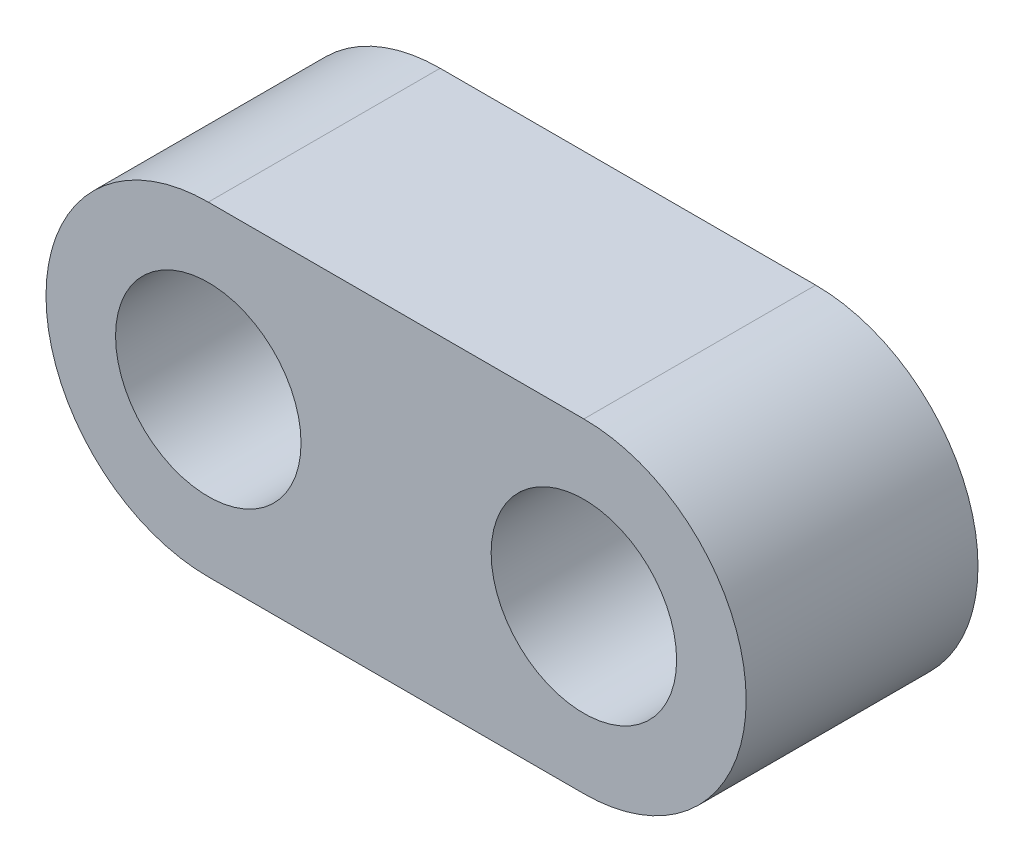
ISO-10303-21;
HEADER;
FILE_DESCRIPTION(('STEP AP214'),'2;1');
FILE_NAME('part.step','',(''),(''),'','','');
FILE_SCHEMA(('AUTOMOTIVE_DESIGN { 1 0 10303 214 1 1 1 1 }'));
ENDSEC;
DATA;
#1=APPLICATION_CONTEXT('core data for automotive mechanical design processes');
#2=APPLICATION_PROTOCOL_DEFINITION('international standard','automotive_design',2000,#1);
#3=PRODUCT_CONTEXT('',#1,'mechanical');
#4=PRODUCT('Part','Part','',(#3));
#5=PRODUCT_RELATED_PRODUCT_CATEGORY('part','',(#4));
#6=PRODUCT_DEFINITION_FORMATION('','',#4);
#7=PRODUCT_DEFINITION_CONTEXT('part definition',#1,'design');
#8=PRODUCT_DEFINITION('design','',#6,#7);
#9=PRODUCT_DEFINITION_SHAPE('','',#8);
#10=(LENGTH_UNIT() NAMED_UNIT(*) SI_UNIT(.MILLI.,.METRE.));
#11=(NAMED_UNIT(*) PLANE_ANGLE_UNIT() SI_UNIT($,.RADIAN.));
#12=(NAMED_UNIT(*) SI_UNIT($,.STERADIAN.) SOLID_ANGLE_UNIT());
#13=UNCERTAINTY_MEASURE_WITH_UNIT(LENGTH_MEASURE(1.E-05),#10,'distance_accuracy_value','');
#14=(GEOMETRIC_REPRESENTATION_CONTEXT(3) GLOBAL_UNCERTAINTY_ASSIGNED_CONTEXT((#13)) GLOBAL_UNIT_ASSIGNED_CONTEXT((#10,
#11,#12)) REPRESENTATION_CONTEXT('',''));
#15=CARTESIAN_POINT('',(0.,0.,0.));
#16=DIRECTION('',(0.,0.,1.));
#17=DIRECTION('',(1.,0.,0.));
#18=AXIS2_PLACEMENT_3D('',#15,#16,#17);
#19=CARTESIAN_POINT('',(0.,-35.,50.));
#20=DIRECTION('',(0.,-1.,0.));
#21=DIRECTION('',(1.,0.,0.));
#22=AXIS2_PLACEMENT_3D('',#19,#20,#21);
#23=PLANE('',#22);
#24=DIRECTION('',(-1.,0.,0.));
#25=VECTOR('',#24,1.);
#26=CARTESIAN_POINT('',(0.,-35.,0.));
#27=LINE('',#26,#25);
#28=CARTESIAN_POINT('',(81.,-35.,0.));
#29=VERTEX_POINT('',#28);
#30=CARTESIAN_POINT('',(0.,-35.,0.));
#31=VERTEX_POINT('',#30);
#32=EDGE_CURVE('E113',#29,#31,#27,.T.);
#33=ORIENTED_EDGE('',*,*,#32,.F.);
#34=DIRECTION('',(0.,0.,-1.));
#35=VECTOR('',#34,1.);
#36=CARTESIAN_POINT('',(81.,-35.,50.));
#37=LINE('',#36,#35);
#38=CARTESIAN_POINT('',(81.,-35.,50.));
#39=VERTEX_POINT('',#38);
#40=EDGE_CURVE('E11',#39,#29,#37,.T.);
#41=ORIENTED_EDGE('',*,*,#40,.F.);
#42=DIRECTION('',(-1.,0.,0.));
#43=VECTOR('',#42,1.);
#44=CARTESIAN_POINT('',(0.,-35.,50.));
#45=LINE('',#44,#43);
#46=CARTESIAN_POINT('',(0.,-35.,50.));
#47=VERTEX_POINT('',#46);
#48=EDGE_CURVE('E94',#39,#47,#45,.T.);
#49=ORIENTED_EDGE('',*,*,#48,.T.);
#50=DIRECTION('',(0.,0.,-1.));
#51=VECTOR('',#50,1.);
#52=CARTESIAN_POINT('',(0.,-35.,50.));
#53=LINE('',#52,#51);
#54=EDGE_CURVE('E84',#47,#31,#53,.T.);
#55=ORIENTED_EDGE('',*,*,#54,.T.);
#56=EDGE_LOOP('',(#33,#41,#49,#55));
#57=FACE_BOUND('',#56,.T.);
#58=ADVANCED_FACE('F44',(#57),#23,.T.);
#59=CARTESIAN_POINT('',(81.,0.,50.));
#60=DIRECTION('',(0.,0.,-1.));
#61=DIRECTION('',(-1.,0.,0.));
#62=AXIS2_PLACEMENT_3D('',#59,#60,#61);
#63=CYLINDRICAL_SURFACE('',#62,35.);
#64=CARTESIAN_POINT('',(81.,0.,0.));
#65=DIRECTION('',(0.,0.,1.));
#66=DIRECTION('',(1.,0.,0.));
#67=AXIS2_PLACEMENT_3D('',#64,#65,#66);
#68=CIRCLE('',#67,35.);
#69=CARTESIAN_POINT('',(81.,35.,0.));
#70=VERTEX_POINT('',#69);
#71=EDGE_CURVE('E99',#29,#70,#68,.T.);
#72=ORIENTED_EDGE('',*,*,#71,.T.);
#73=DIRECTION('',(0.,0.,-1.));
#74=VECTOR('',#73,1.);
#75=CARTESIAN_POINT('',(81.,35.,50.));
#76=LINE('',#75,#74);
#77=CARTESIAN_POINT('',(81.,35.,50.));
#78=VERTEX_POINT('',#77);
#79=EDGE_CURVE('E53',#78,#70,#76,.T.);
#80=ORIENTED_EDGE('',*,*,#79,.F.);
#81=CARTESIAN_POINT('',(81.,0.,50.));
#82=DIRECTION('',(0.,0.,1.));
#83=DIRECTION('',(1.,0.,0.));
#84=AXIS2_PLACEMENT_3D('',#81,#82,#83);
#85=CIRCLE('',#84,35.);
#86=EDGE_CURVE('E90',#39,#78,#85,.T.);
#87=ORIENTED_EDGE('',*,*,#86,.F.);
#88=ORIENTED_EDGE('',*,*,#40,.T.);
#89=EDGE_LOOP('',(#72,#80,#87,#88));
#90=FACE_BOUND('',#89,.T.);
#91=ADVANCED_FACE('F98',(#90),#63,.T.);
#92=CARTESIAN_POINT('',(0.,35.,50.));
#93=DIRECTION('',(0.,1.,0.));
#94=DIRECTION('',(-1.,0.,0.));
#95=AXIS2_PLACEMENT_3D('',#92,#93,#94);
#96=PLANE('',#95);
#97=DIRECTION('',(1.,0.,0.));
#98=VECTOR('',#97,1.);
#99=CARTESIAN_POINT('',(0.,35.,0.));
#100=LINE('',#99,#98);
#101=CARTESIAN_POINT('',(0.,35.,0.));
#102=VERTEX_POINT('',#101);
#103=EDGE_CURVE('E120',#102,#70,#100,.T.);
#104=ORIENTED_EDGE('',*,*,#103,.F.);
#105=DIRECTION('',(0.,0.,-1.));
#106=VECTOR('',#105,1.);
#107=CARTESIAN_POINT('',(0.,35.,50.));
#108=LINE('',#107,#106);
#109=CARTESIAN_POINT('',(0.,35.,50.));
#110=VERTEX_POINT('',#109);
#111=EDGE_CURVE('E79',#110,#102,#108,.T.);
#112=ORIENTED_EDGE('',*,*,#111,.F.);
#113=DIRECTION('',(1.,0.,0.));
#114=VECTOR('',#113,1.);
#115=CARTESIAN_POINT('',(0.,35.,50.));
#116=LINE('',#115,#114);
#117=EDGE_CURVE('E91',#110,#78,#116,.T.);
#118=ORIENTED_EDGE('',*,*,#117,.T.);
#119=ORIENTED_EDGE('',*,*,#79,.T.);
#120=EDGE_LOOP('',(#104,#112,#118,#119));
#121=FACE_BOUND('',#120,.T.);
#122=ADVANCED_FACE('F102',(#121),#96,.T.);
#123=CARTESIAN_POINT('',(0.,0.,50.));
#124=DIRECTION('',(0.,0.,-1.));
#125=DIRECTION('',(-1.,0.,0.));
#126=AXIS2_PLACEMENT_3D('',#123,#124,#125);
#127=CYLINDRICAL_SURFACE('',#126,20.);
#128=CARTESIAN_POINT('',(0.,0.,50.));
#129=DIRECTION('',(0.,0.,1.));
#130=DIRECTION('',(1.,0.,0.));
#131=AXIS2_PLACEMENT_3D('',#128,#129,#130);
#132=CIRCLE('',#131,20.);
#133=CARTESIAN_POINT('',(20.,0.,50.));
#134=VERTEX_POINT('',#133);
#135=EDGE_CURVE('E127',#134,#134,#132,.T.);
#136=ORIENTED_EDGE('',*,*,#135,.T.);
#137=EDGE_LOOP('',(#136));
#138=FACE_BOUND('',#137,.T.);
#139=CARTESIAN_POINT('',(0.,0.,0.));
#140=DIRECTION('',(0.,0.,1.));
#141=DIRECTION('',(1.,0.,0.));
#142=AXIS2_PLACEMENT_3D('',#139,#140,#141);
#143=CIRCLE('',#142,20.);
#144=CARTESIAN_POINT('',(20.,0.,0.));
#145=VERTEX_POINT('',#144);
#146=EDGE_CURVE('E115',#145,#145,#143,.T.);
#147=ORIENTED_EDGE('',*,*,#146,.F.);
#148=EDGE_LOOP('',(#147));
#149=FACE_BOUND('',#148,.T.);
#150=ADVANCED_FACE('F139',(#138,#149),#127,.F.);
#151=CARTESIAN_POINT('',(81.,0.,50.));
#152=DIRECTION('',(0.,0.,-1.));
#153=DIRECTION('',(-1.,0.,0.));
#154=AXIS2_PLACEMENT_3D('',#151,#152,#153);
#155=CYLINDRICAL_SURFACE('',#154,20.);
#156=CARTESIAN_POINT('',(81.,0.,50.));
#157=DIRECTION('',(0.,0.,1.));
#158=DIRECTION('',(1.,0.,0.));
#159=AXIS2_PLACEMENT_3D('',#156,#157,#158);
#160=CIRCLE('',#159,20.);
#161=CARTESIAN_POINT('',(101.,0.,50.));
#162=VERTEX_POINT('',#161);
#163=EDGE_CURVE('E123',#162,#162,#160,.T.);
#164=ORIENTED_EDGE('',*,*,#163,.T.);
#165=EDGE_LOOP('',(#164));
#166=FACE_BOUND('',#165,.T.);
#167=CARTESIAN_POINT('',(81.,0.,0.));
#168=DIRECTION('',(0.,0.,1.));
#169=DIRECTION('',(1.,0.,0.));
#170=AXIS2_PLACEMENT_3D('',#167,#168,#169);
#171=CIRCLE('',#170,20.);
#172=CARTESIAN_POINT('',(101.,0.,0.));
#173=VERTEX_POINT('',#172);
#174=EDGE_CURVE('E108',#173,#173,#171,.T.);
#175=ORIENTED_EDGE('',*,*,#174,.F.);
#176=EDGE_LOOP('',(#175));
#177=FACE_BOUND('',#176,.T.);
#178=ADVANCED_FACE('F50',(#166,#177),#155,.F.);
#179=CARTESIAN_POINT('',(0.,0.,50.));
#180=DIRECTION('',(0.,0.,-1.));
#181=DIRECTION('',(-1.,0.,0.));
#182=AXIS2_PLACEMENT_3D('',#179,#180,#181);
#183=CYLINDRICAL_SURFACE('',#182,35.);
#184=CARTESIAN_POINT('',(0.,0.,0.));
#185=DIRECTION('',(0.,0.,1.));
#186=DIRECTION('',(1.,0.,0.));
#187=AXIS2_PLACEMENT_3D('',#184,#185,#186);
#188=CIRCLE('',#187,35.);
#189=EDGE_CURVE('E122',#102,#31,#188,.T.);
#190=ORIENTED_EDGE('',*,*,#189,.T.);
#191=ORIENTED_EDGE('',*,*,#54,.F.);
#192=CARTESIAN_POINT('',(0.,0.,50.));
#193=DIRECTION('',(0.,0.,1.));
#194=DIRECTION('',(1.,0.,0.));
#195=AXIS2_PLACEMENT_3D('',#192,#193,#194);
#196=CIRCLE('',#195,35.);
#197=EDGE_CURVE('E64',#110,#47,#196,.T.);
#198=ORIENTED_EDGE('',*,*,#197,.F.);
#199=ORIENTED_EDGE('',*,*,#111,.T.);
#200=EDGE_LOOP('',(#190,#191,#198,#199));
#201=FACE_BOUND('',#200,.T.);
#202=ADVANCED_FACE('F148',(#201),#183,.T.);
#203=CARTESIAN_POINT('',(0.,0.,50.));
#204=DIRECTION('',(0.,0.,1.));
#205=DIRECTION('',(1.,0.,0.));
#206=AXIS2_PLACEMENT_3D('',#203,#204,#205);
#207=PLANE('',#206);
#208=ORIENTED_EDGE('',*,*,#163,.F.);
#209=EDGE_LOOP('',(#208));
#210=FACE_BOUND('',#209,.T.);
#211=ORIENTED_EDGE('',*,*,#135,.F.);
#212=EDGE_LOOP('',(#211));
#213=FACE_BOUND('',#212,.T.);
#214=ORIENTED_EDGE('',*,*,#48,.F.);
#215=ORIENTED_EDGE('',*,*,#86,.T.);
#216=ORIENTED_EDGE('',*,*,#117,.F.);
#217=ORIENTED_EDGE('',*,*,#197,.T.);
#218=EDGE_LOOP('',(#214,#215,#216,#217));
#219=FACE_BOUND('',#218,.T.);
#220=ADVANCED_FACE('F93',(#210,#213,#219),#207,.T.);
#221=CARTESIAN_POINT('',(0.,0.,0.));
#222=DIRECTION('',(0.,0.,1.));
#223=DIRECTION('',(1.,0.,0.));
#224=AXIS2_PLACEMENT_3D('',#221,#222,#223);
#225=PLANE('',#224);
#226=ORIENTED_EDGE('',*,*,#174,.T.);
#227=EDGE_LOOP('',(#226));
#228=FACE_BOUND('',#227,.T.);
#229=ORIENTED_EDGE('',*,*,#146,.T.);
#230=EDGE_LOOP('',(#229));
#231=FACE_BOUND('',#230,.T.);
#232=ORIENTED_EDGE('',*,*,#32,.T.);
#233=ORIENTED_EDGE('',*,*,#189,.F.);
#234=ORIENTED_EDGE('',*,*,#103,.T.);
#235=ORIENTED_EDGE('',*,*,#71,.F.);
#236=EDGE_LOOP('',(#232,#233,#234,#235));
#237=FACE_BOUND('',#236,.T.);
#238=ADVANCED_FACE('F151',(#228,#231,#237),#225,.F.);
#239=CLOSED_SHELL('',(#58,#91,#122,#150,#178,#202,#220,#238));
#240=MANIFOLD_SOLID_BREP('B2',#239);
#241=ADVANCED_BREP_SHAPE_REPRESENTATION('',(#18,#240),#14);
#242=SHAPE_DEFINITION_REPRESENTATION(#9,#241);
ENDSEC;
END-ISO-10303-21;
